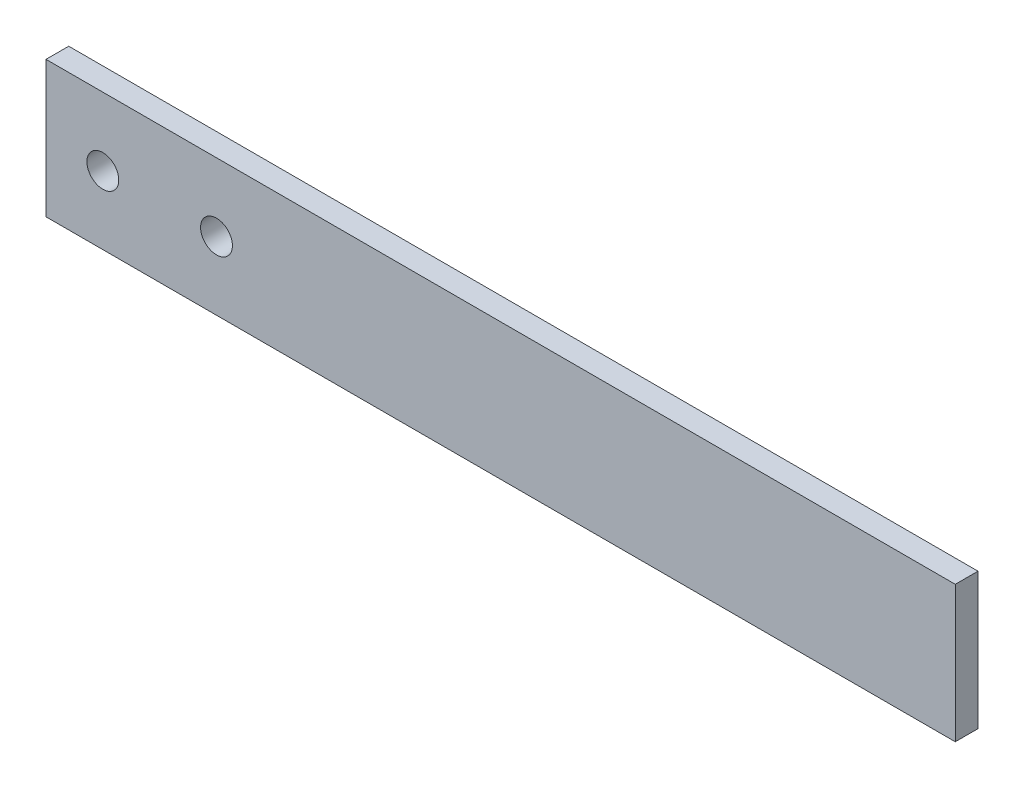
ISO-10303-21;
HEADER;
FILE_DESCRIPTION(('STEP AP214'),'2;1');
FILE_NAME('part.step','',(''),(''),'','','');
FILE_SCHEMA(('AUTOMOTIVE_DESIGN { 1 0 10303 214 1 1 1 1 }'));
ENDSEC;
DATA;
#1=APPLICATION_CONTEXT('core data for automotive mechanical design processes');
#2=APPLICATION_PROTOCOL_DEFINITION('international standard','automotive_design',2000,#1);
#3=PRODUCT_CONTEXT('',#1,'mechanical');
#4=PRODUCT('Part','Part','',(#3));
#5=PRODUCT_RELATED_PRODUCT_CATEGORY('part','',(#4));
#6=PRODUCT_DEFINITION_FORMATION('','',#4);
#7=PRODUCT_DEFINITION_CONTEXT('part definition',#1,'design');
#8=PRODUCT_DEFINITION('design','',#6,#7);
#9=PRODUCT_DEFINITION_SHAPE('','',#8);
#10=(LENGTH_UNIT() NAMED_UNIT(*) SI_UNIT(.MILLI.,.METRE.));
#11=(NAMED_UNIT(*) PLANE_ANGLE_UNIT() SI_UNIT($,.RADIAN.));
#12=(NAMED_UNIT(*) SI_UNIT($,.STERADIAN.) SOLID_ANGLE_UNIT());
#13=UNCERTAINTY_MEASURE_WITH_UNIT(LENGTH_MEASURE(1.E-05),#10,'distance_accuracy_value','');
#14=(GEOMETRIC_REPRESENTATION_CONTEXT(3) GLOBAL_UNCERTAINTY_ASSIGNED_CONTEXT((#13)) GLOBAL_UNIT_ASSIGNED_CONTEXT((#10,
#11,#12)) REPRESENTATION_CONTEXT('',''));
#15=CARTESIAN_POINT('',(0.,0.,0.));
#16=DIRECTION('',(0.,0.,1.));
#17=DIRECTION('',(1.,0.,0.));
#18=AXIS2_PLACEMENT_3D('',#15,#16,#17);
#19=CARTESIAN_POINT('',(200.,-30.,10.));
#20=DIRECTION('',(-1.,0.,0.));
#21=DIRECTION('',(0.,0.,1.));
#22=AXIS2_PLACEMENT_3D('',#19,#20,#21);
#23=PLANE('',#22);
#24=DIRECTION('',(0.,1.,0.));
#25=VECTOR('',#24,1.);
#26=CARTESIAN_POINT('',(200.,-30.,0.));
#27=LINE('',#26,#25);
#28=CARTESIAN_POINT('',(200.,-30.,0.));
#29=VERTEX_POINT('',#28);
#30=CARTESIAN_POINT('',(200.,30.,0.));
#31=VERTEX_POINT('',#30);
#32=EDGE_CURVE('E96',#29,#31,#27,.T.);
#33=ORIENTED_EDGE('',*,*,#32,.T.);
#34=DIRECTION('',(0.,0.,-1.));
#35=VECTOR('',#34,1.);
#36=CARTESIAN_POINT('',(200.,30.,10.));
#37=LINE('',#36,#35);
#38=CARTESIAN_POINT('',(200.,30.,10.));
#39=VERTEX_POINT('',#38);
#40=EDGE_CURVE('E11',#39,#31,#37,.T.);
#41=ORIENTED_EDGE('',*,*,#40,.F.);
#42=DIRECTION('',(0.,1.,0.));
#43=VECTOR('',#42,1.);
#44=CARTESIAN_POINT('',(200.,-30.,10.));
#45=LINE('',#44,#43);
#46=CARTESIAN_POINT('',(200.,-30.,10.));
#47=VERTEX_POINT('',#46);
#48=EDGE_CURVE('E84',#47,#39,#45,.T.);
#49=ORIENTED_EDGE('',*,*,#48,.F.);
#50=DIRECTION('',(0.,0.,-1.));
#51=VECTOR('',#50,1.);
#52=CARTESIAN_POINT('',(200.,-30.,10.));
#53=LINE('',#52,#51);
#54=EDGE_CURVE('E92',#47,#29,#53,.T.);
#55=ORIENTED_EDGE('',*,*,#54,.T.);
#56=EDGE_LOOP('',(#33,#41,#49,#55));
#57=FACE_BOUND('',#56,.T.);
#58=ADVANCED_FACE('F33',(#57),#23,.F.);
#59=CARTESIAN_POINT('',(-200.,30.,10.));
#60=DIRECTION('',(0.,-1.,0.));
#61=DIRECTION('',(0.,0.,-1.));
#62=AXIS2_PLACEMENT_3D('',#59,#60,#61);
#63=PLANE('',#62);
#64=DIRECTION('',(-1.,0.,0.));
#65=VECTOR('',#64,1.);
#66=CARTESIAN_POINT('',(-200.,30.,0.));
#67=LINE('',#66,#65);
#68=CARTESIAN_POINT('',(-200.,30.,0.));
#69=VERTEX_POINT('',#68);
#70=EDGE_CURVE('E88',#31,#69,#67,.T.);
#71=ORIENTED_EDGE('',*,*,#70,.T.);
#72=DIRECTION('',(0.,0.,-1.));
#73=VECTOR('',#72,1.);
#74=CARTESIAN_POINT('',(-200.,30.,10.));
#75=LINE('',#74,#73);
#76=CARTESIAN_POINT('',(-200.,30.,10.));
#77=VERTEX_POINT('',#76);
#78=EDGE_CURVE('E41',#77,#69,#75,.T.);
#79=ORIENTED_EDGE('',*,*,#78,.F.);
#80=DIRECTION('',(-1.,0.,0.));
#81=VECTOR('',#80,1.);
#82=CARTESIAN_POINT('',(-200.,30.,10.));
#83=LINE('',#82,#81);
#84=EDGE_CURVE('E79',#39,#77,#83,.T.);
#85=ORIENTED_EDGE('',*,*,#84,.F.);
#86=ORIENTED_EDGE('',*,*,#40,.T.);
#87=EDGE_LOOP('',(#71,#79,#85,#86));
#88=FACE_BOUND('',#87,.T.);
#89=ADVANCED_FACE('F87',(#88),#63,.F.);
#90=CARTESIAN_POINT('',(-200.,-30.,10.));
#91=DIRECTION('',(1.,0.,0.));
#92=DIRECTION('',(0.,0.,-1.));
#93=AXIS2_PLACEMENT_3D('',#90,#91,#92);
#94=PLANE('',#93);
#95=DIRECTION('',(0.,-1.,0.));
#96=VECTOR('',#95,1.);
#97=CARTESIAN_POINT('',(-200.,-30.,0.));
#98=LINE('',#97,#96);
#99=CARTESIAN_POINT('',(-200.,-30.,0.));
#100=VERTEX_POINT('',#99);
#101=EDGE_CURVE('E66',#69,#100,#98,.T.);
#102=ORIENTED_EDGE('',*,*,#101,.T.);
#103=DIRECTION('',(0.,0.,-1.));
#104=VECTOR('',#103,1.);
#105=CARTESIAN_POINT('',(-200.,-30.,10.));
#106=LINE('',#105,#104);
#107=CARTESIAN_POINT('',(-200.,-30.,10.));
#108=VERTEX_POINT('',#107);
#109=EDGE_CURVE('E89',#108,#100,#106,.T.);
#110=ORIENTED_EDGE('',*,*,#109,.F.);
#111=DIRECTION('',(0.,-1.,0.));
#112=VECTOR('',#111,1.);
#113=CARTESIAN_POINT('',(-200.,-30.,10.));
#114=LINE('',#113,#112);
#115=EDGE_CURVE('E82',#77,#108,#114,.T.);
#116=ORIENTED_EDGE('',*,*,#115,.F.);
#117=ORIENTED_EDGE('',*,*,#78,.T.);
#118=EDGE_LOOP('',(#102,#110,#116,#117));
#119=FACE_BOUND('',#118,.T.);
#120=ADVANCED_FACE('F90',(#119),#94,.F.);
#121=CARTESIAN_POINT('',(-200.,-30.,10.));
#122=DIRECTION('',(0.,1.,0.));
#123=DIRECTION('',(0.,0.,1.));
#124=AXIS2_PLACEMENT_3D('',#121,#122,#123);
#125=PLANE('',#124);
#126=DIRECTION('',(1.,0.,0.));
#127=VECTOR('',#126,1.);
#128=CARTESIAN_POINT('',(-200.,-30.,0.));
#129=LINE('',#128,#127);
#130=EDGE_CURVE('E72',#100,#29,#129,.T.);
#131=ORIENTED_EDGE('',*,*,#130,.T.);
#132=ORIENTED_EDGE('',*,*,#54,.F.);
#133=DIRECTION('',(1.,0.,0.));
#134=VECTOR('',#133,1.);
#135=CARTESIAN_POINT('',(-200.,-30.,10.));
#136=LINE('',#135,#134);
#137=EDGE_CURVE('E49',#108,#47,#136,.T.);
#138=ORIENTED_EDGE('',*,*,#137,.F.);
#139=ORIENTED_EDGE('',*,*,#109,.T.);
#140=EDGE_LOOP('',(#131,#132,#138,#139));
#141=FACE_BOUND('',#140,.T.);
#142=ADVANCED_FACE('F104',(#141),#125,.F.);
#143=CARTESIAN_POINT('',(0.,0.,10.));
#144=DIRECTION('',(0.,0.,-1.));
#145=DIRECTION('',(-1.,0.,0.));
#146=AXIS2_PLACEMENT_3D('',#143,#144,#145);
#147=PLANE('',#146);
#148=CARTESIAN_POINT('',(-175.,0.,10.));
#149=DIRECTION('',(0.,0.,1.));
#150=DIRECTION('',(1.,0.,0.));
#151=AXIS2_PLACEMENT_3D('',#148,#149,#150);
#152=CIRCLE('',#151,7.00000000000001);
#153=CARTESIAN_POINT('',(-168.,0.,10.));
#154=VERTEX_POINT('',#153);
#155=EDGE_CURVE('E116',#154,#154,#152,.T.);
#156=ORIENTED_EDGE('',*,*,#155,.F.);
#157=EDGE_LOOP('',(#156));
#158=FACE_BOUND('',#157,.T.);
#159=CARTESIAN_POINT('',(-125.,0.,10.));
#160=DIRECTION('',(0.,0.,1.));
#161=DIRECTION('',(1.,0.,0.));
#162=AXIS2_PLACEMENT_3D('',#159,#160,#161);
#163=CIRCLE('',#162,7.);
#164=CARTESIAN_POINT('',(-118.,0.,10.));
#165=VERTEX_POINT('',#164);
#166=EDGE_CURVE('E110',#165,#165,#163,.T.);
#167=ORIENTED_EDGE('',*,*,#166,.F.);
#168=EDGE_LOOP('',(#167));
#169=FACE_BOUND('',#168,.T.);
#170=ORIENTED_EDGE('',*,*,#48,.T.);
#171=ORIENTED_EDGE('',*,*,#84,.T.);
#172=ORIENTED_EDGE('',*,*,#115,.T.);
#173=ORIENTED_EDGE('',*,*,#137,.T.);
#174=EDGE_LOOP('',(#170,#171,#172,#173));
#175=FACE_BOUND('',#174,.T.);
#176=ADVANCED_FACE('F80',(#158,#169,#175),#147,.F.);
#177=CARTESIAN_POINT('',(0.,0.,0.));
#178=DIRECTION('',(0.,0.,-1.));
#179=DIRECTION('',(-1.,0.,0.));
#180=AXIS2_PLACEMENT_3D('',#177,#178,#179);
#181=PLANE('',#180);
#182=CARTESIAN_POINT('',(-175.,0.,0.));
#183=DIRECTION('',(0.,0.,1.));
#184=DIRECTION('',(1.,0.,0.));
#185=AXIS2_PLACEMENT_3D('',#182,#183,#184);
#186=CIRCLE('',#185,7.00000000000001);
#187=CARTESIAN_POINT('',(-168.,0.,0.));
#188=VERTEX_POINT('',#187);
#189=EDGE_CURVE('E99',#188,#188,#186,.T.);
#190=ORIENTED_EDGE('',*,*,#189,.T.);
#191=EDGE_LOOP('',(#190));
#192=FACE_BOUND('',#191,.T.);
#193=CARTESIAN_POINT('',(-125.,0.,0.));
#194=DIRECTION('',(0.,0.,1.));
#195=DIRECTION('',(1.,0.,0.));
#196=AXIS2_PLACEMENT_3D('',#193,#194,#195);
#197=CIRCLE('',#196,7.);
#198=CARTESIAN_POINT('',(-118.,0.,0.));
#199=VERTEX_POINT('',#198);
#200=EDGE_CURVE('E113',#199,#199,#197,.T.);
#201=ORIENTED_EDGE('',*,*,#200,.T.);
#202=EDGE_LOOP('',(#201));
#203=FACE_BOUND('',#202,.T.);
#204=ORIENTED_EDGE('',*,*,#32,.F.);
#205=ORIENTED_EDGE('',*,*,#130,.F.);
#206=ORIENTED_EDGE('',*,*,#101,.F.);
#207=ORIENTED_EDGE('',*,*,#70,.F.);
#208=EDGE_LOOP('',(#204,#205,#206,#207));
#209=FACE_BOUND('',#208,.T.);
#210=ADVANCED_FACE('F107',(#192,#203,#209),#181,.T.);
#211=CARTESIAN_POINT('',(-125.,0.,0.));
#212=DIRECTION('',(0.,0.,1.));
#213=DIRECTION('',(1.,0.,0.));
#214=AXIS2_PLACEMENT_3D('',#211,#212,#213);
#215=CYLINDRICAL_SURFACE('',#214,7.);
#216=ORIENTED_EDGE('',*,*,#200,.F.);
#217=EDGE_LOOP('',(#216));
#218=FACE_BOUND('',#217,.T.);
#219=ORIENTED_EDGE('',*,*,#166,.T.);
#220=EDGE_LOOP('',(#219));
#221=FACE_BOUND('',#220,.T.);
#222=ADVANCED_FACE('F127',(#218,#221),#215,.F.);
#223=CARTESIAN_POINT('',(-175.,0.,0.));
#224=DIRECTION('',(0.,0.,1.));
#225=DIRECTION('',(1.,0.,0.));
#226=AXIS2_PLACEMENT_3D('',#223,#224,#225);
#227=CYLINDRICAL_SURFACE('',#226,7.00000000000001);
#228=ORIENTED_EDGE('',*,*,#189,.F.);
#229=EDGE_LOOP('',(#228));
#230=FACE_BOUND('',#229,.T.);
#231=ORIENTED_EDGE('',*,*,#155,.T.);
#232=EDGE_LOOP('',(#231));
#233=FACE_BOUND('',#232,.T.);
#234=ADVANCED_FACE('F124',(#230,#233),#227,.F.);
#235=CLOSED_SHELL('',(#58,#89,#120,#142,#176,#210,#222,#234));
#236=MANIFOLD_SOLID_BREP('B2',#235);
#237=ADVANCED_BREP_SHAPE_REPRESENTATION('',(#18,#236),#14);
#238=SHAPE_DEFINITION_REPRESENTATION(#9,#237);
ENDSEC;
END-ISO-10303-21;
